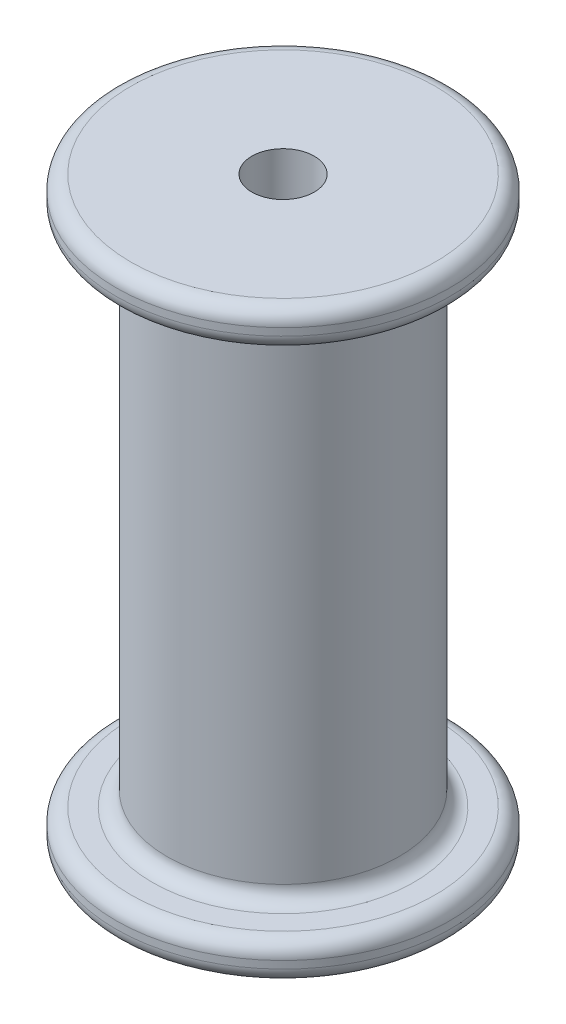
ISO-10303-21;
HEADER;
FILE_DESCRIPTION(('STEP AP214'),'2;1');
FILE_NAME('part.step','',(''),(''),'','','');
FILE_SCHEMA(('AUTOMOTIVE_DESIGN { 1 0 10303 214 1 1 1 1 }'));
ENDSEC;
DATA;
#1=APPLICATION_CONTEXT('core data for automotive mechanical design processes');
#2=APPLICATION_PROTOCOL_DEFINITION('international standard','automotive_design',2000,#1);
#3=PRODUCT_CONTEXT('',#1,'mechanical');
#4=PRODUCT('Part','Part','',(#3));
#5=PRODUCT_RELATED_PRODUCT_CATEGORY('part','',(#4));
#6=PRODUCT_DEFINITION_FORMATION('','',#4);
#7=PRODUCT_DEFINITION_CONTEXT('part definition',#1,'design');
#8=PRODUCT_DEFINITION('design','',#6,#7);
#9=PRODUCT_DEFINITION_SHAPE('','',#8);
#10=(LENGTH_UNIT() NAMED_UNIT(*) SI_UNIT(.MILLI.,.METRE.));
#11=(NAMED_UNIT(*) PLANE_ANGLE_UNIT() SI_UNIT($,.RADIAN.));
#12=(NAMED_UNIT(*) SI_UNIT($,.STERADIAN.) SOLID_ANGLE_UNIT());
#13=UNCERTAINTY_MEASURE_WITH_UNIT(LENGTH_MEASURE(1.E-05),#10,'distance_accuracy_value','');
#14=(GEOMETRIC_REPRESENTATION_CONTEXT(3) GLOBAL_UNCERTAINTY_ASSIGNED_CONTEXT((#13)) GLOBAL_UNIT_ASSIGNED_CONTEXT((#10,
#11,#12)) REPRESENTATION_CONTEXT('',''));
#15=CARTESIAN_POINT('',(0.,0.,0.));
#16=DIRECTION('',(0.,0.,1.));
#17=DIRECTION('',(1.,0.,0.));
#18=AXIS2_PLACEMENT_3D('',#15,#16,#17);
#19=CARTESIAN_POINT('',(0.,50.038,0.));
#20=DIRECTION('',(0.,-1.,0.));
#21=DIRECTION('',(0.,0.,-1.));
#22=AXIS2_PLACEMENT_3D('',#19,#20,#21);
#23=CYLINDRICAL_SURFACE('',#22,9.906);
#24=CARTESIAN_POINT('',(0.,4.445,0.));
#25=DIRECTION('',(0.,1.,0.));
#26=DIRECTION('',(0.,0.,1.));
#27=AXIS2_PLACEMENT_3D('',#24,#25,#26);
#28=CIRCLE('',#27,9.906);
#29=CARTESIAN_POINT('',(0.,4.445,9.906));
#30=VERTEX_POINT('',#29);
#31=EDGE_CURVE('E54',#30,#30,#28,.T.);
#32=ORIENTED_EDGE('',*,*,#31,.T.);
#33=EDGE_LOOP('',(#32));
#34=FACE_BOUND('',#33,.T.);
#35=CARTESIAN_POINT('',(0.,45.593,0.));
#36=DIRECTION('',(0.,1.,0.));
#37=DIRECTION('',(0.,0.,1.));
#38=AXIS2_PLACEMENT_3D('',#35,#36,#37);
#39=CIRCLE('',#38,9.906);
#40=CARTESIAN_POINT('',(0.,45.593,9.906));
#41=VERTEX_POINT('',#40);
#42=EDGE_CURVE('E57',#41,#41,#39,.F.);
#43=ORIENTED_EDGE('',*,*,#42,.T.);
#44=EDGE_LOOP('',(#43));
#45=FACE_BOUND('',#44,.T.);
#46=ADVANCED_FACE('F31',(#34,#45),#23,.T.);
#47=CARTESIAN_POINT('',(0.,50.038,0.));
#48=DIRECTION('',(0.,1.,0.));
#49=DIRECTION('',(0.,0.,1.));
#50=AXIS2_PLACEMENT_3D('',#47,#48,#49);
#51=PLANE('',#50);
#52=CARTESIAN_POINT('',(0.,50.038,0.));
#53=DIRECTION('',(0.,1.,0.));
#54=DIRECTION('',(0.,0.,1.));
#55=AXIS2_PLACEMENT_3D('',#52,#53,#54);
#56=CIRCLE('',#55,13.0175);
#57=CARTESIAN_POINT('',(0.,50.038,13.0175));
#58=VERTEX_POINT('',#57);
#59=EDGE_CURVE('E51',#58,#58,#56,.T.);
#60=ORIENTED_EDGE('',*,*,#59,.T.);
#61=EDGE_LOOP('',(#60));
#62=FACE_BOUND('',#61,.T.);
#63=CARTESIAN_POINT('',(0.,50.038,0.));
#64=DIRECTION('',(0.,1.,0.));
#65=DIRECTION('',(0.,0.,1.));
#66=AXIS2_PLACEMENT_3D('',#63,#64,#65);
#67=CIRCLE('',#66,2.667);
#68=CARTESIAN_POINT('',(0.,50.038,2.667));
#69=VERTEX_POINT('',#68);
#70=EDGE_CURVE('E75',#69,#69,#67,.T.);
#71=ORIENTED_EDGE('',*,*,#70,.F.);
#72=EDGE_LOOP('',(#71));
#73=FACE_BOUND('',#72,.T.);
#74=ADVANCED_FACE('F85',(#62,#73),#51,.T.);
#75=CARTESIAN_POINT('',(0.,0.,0.));
#76=DIRECTION('',(0.,1.,0.));
#77=DIRECTION('',(0.,0.,1.));
#78=AXIS2_PLACEMENT_3D('',#75,#76,#77);
#79=PLANE('',#78);
#80=CARTESIAN_POINT('',(0.,0.,0.));
#81=DIRECTION('',(0.,1.,0.));
#82=DIRECTION('',(0.,0.,1.));
#83=AXIS2_PLACEMENT_3D('',#80,#81,#82);
#84=CIRCLE('',#83,13.0175);
#85=CARTESIAN_POINT('',(0.,0.,13.0175));
#86=VERTEX_POINT('',#85);
#87=EDGE_CURVE('E66',#86,#86,#84,.F.);
#88=ORIENTED_EDGE('',*,*,#87,.T.);
#89=EDGE_LOOP('',(#88));
#90=FACE_BOUND('',#89,.T.);
#91=CARTESIAN_POINT('',(0.,0.,0.));
#92=DIRECTION('',(0.,1.,0.));
#93=DIRECTION('',(0.,0.,1.));
#94=AXIS2_PLACEMENT_3D('',#91,#92,#93);
#95=CIRCLE('',#94,2.667);
#96=CARTESIAN_POINT('',(0.,0.,2.667));
#97=VERTEX_POINT('',#96);
#98=EDGE_CURVE('E76',#97,#97,#95,.T.);
#99=ORIENTED_EDGE('',*,*,#98,.T.);
#100=EDGE_LOOP('',(#99));
#101=FACE_BOUND('',#100,.T.);
#102=ADVANCED_FACE('F87',(#90,#101),#79,.F.);
#103=CARTESIAN_POINT('',(0.,50.038,0.));
#104=DIRECTION('',(0.,-1.,0.));
#105=DIRECTION('',(0.,0.,-1.));
#106=AXIS2_PLACEMENT_3D('',#103,#104,#105);
#107=CYLINDRICAL_SURFACE('',#106,2.667);
#108=ORIENTED_EDGE('',*,*,#70,.T.);
#109=EDGE_LOOP('',(#108));
#110=FACE_BOUND('',#109,.T.);
#111=ORIENTED_EDGE('',*,*,#98,.F.);
#112=EDGE_LOOP('',(#111));
#113=FACE_BOUND('',#112,.T.);
#114=ADVANCED_FACE('F82',(#110,#113),#107,.F.);
#115=CARTESIAN_POINT('',(0.,46.863,0.));
#116=DIRECTION('',(0.,1.,0.));
#117=DIRECTION('',(0.,0.,1.));
#118=AXIS2_PLACEMENT_3D('',#115,#116,#117);
#119=PLANE('',#118);
#120=CARTESIAN_POINT('',(0.,46.863,0.));
#121=DIRECTION('',(0.,1.,0.));
#122=DIRECTION('',(0.,0.,1.));
#123=AXIS2_PLACEMENT_3D('',#120,#121,#122);
#124=CIRCLE('',#123,13.0175);
#125=CARTESIAN_POINT('',(0.,46.863,13.0175));
#126=VERTEX_POINT('',#125);
#127=EDGE_CURVE('E10',#126,#126,#124,.F.);
#128=ORIENTED_EDGE('',*,*,#127,.T.);
#129=EDGE_LOOP('',(#128));
#130=FACE_BOUND('',#129,.T.);
#131=CARTESIAN_POINT('',(0.,46.863,0.));
#132=DIRECTION('',(0.,1.,0.));
#133=DIRECTION('',(0.,0.,1.));
#134=AXIS2_PLACEMENT_3D('',#131,#132,#133);
#135=CIRCLE('',#134,11.176);
#136=CARTESIAN_POINT('',(0.,46.863,11.176));
#137=VERTEX_POINT('',#136);
#138=EDGE_CURVE('E38',#137,#137,#135,.T.);
#139=ORIENTED_EDGE('',*,*,#138,.T.);
#140=EDGE_LOOP('',(#139));
#141=FACE_BOUND('',#140,.T.);
#142=ADVANCED_FACE('F130',(#130,#141),#119,.F.);
#143=CARTESIAN_POINT('',(0.,46.863,0.));
#144=DIRECTION('',(0.,1.,0.));
#145=DIRECTION('',(0.,0.,1.));
#146=AXIS2_PLACEMENT_3D('',#143,#144,#145);
#147=CYLINDRICAL_SURFACE('',#146,14.2875);
#148=CARTESIAN_POINT('',(0.,48.768,0.));
#149=DIRECTION('',(0.,1.,0.));
#150=DIRECTION('',(0.,0.,1.));
#151=AXIS2_PLACEMENT_3D('',#148,#149,#150);
#152=CIRCLE('',#151,14.2875);
#153=CARTESIAN_POINT('',(0.,48.768,14.2875));
#154=VERTEX_POINT('',#153);
#155=EDGE_CURVE('E42',#154,#154,#152,.F.);
#156=ORIENTED_EDGE('',*,*,#155,.T.);
#157=EDGE_LOOP('',(#156));
#158=FACE_BOUND('',#157,.T.);
#159=CARTESIAN_POINT('',(0.,48.133,0.));
#160=DIRECTION('',(0.,1.,0.));
#161=DIRECTION('',(0.,0.,1.));
#162=AXIS2_PLACEMENT_3D('',#159,#160,#161);
#163=CIRCLE('',#162,14.2875);
#164=CARTESIAN_POINT('',(0.,48.133,14.2875));
#165=VERTEX_POINT('',#164);
#166=EDGE_CURVE('E46',#165,#165,#163,.T.);
#167=ORIENTED_EDGE('',*,*,#166,.T.);
#168=EDGE_LOOP('',(#167));
#169=FACE_BOUND('',#168,.T.);
#170=ADVANCED_FACE('F127',(#158,#169),#147,.T.);
#171=CARTESIAN_POINT('',(0.,3.175,0.));
#172=DIRECTION('',(0.,1.,0.));
#173=DIRECTION('',(0.,0.,1.));
#174=AXIS2_PLACEMENT_3D('',#171,#172,#173);
#175=PLANE('',#174);
#176=CARTESIAN_POINT('',(0.,3.175,0.));
#177=DIRECTION('',(0.,1.,0.));
#178=DIRECTION('',(0.,0.,1.));
#179=AXIS2_PLACEMENT_3D('',#176,#177,#178);
#180=CIRCLE('',#179,13.0175);
#181=CARTESIAN_POINT('',(0.,3.175,13.0175));
#182=VERTEX_POINT('',#181);
#183=EDGE_CURVE('E60',#182,#182,#180,.T.);
#184=ORIENTED_EDGE('',*,*,#183,.T.);
#185=EDGE_LOOP('',(#184));
#186=FACE_BOUND('',#185,.T.);
#187=CARTESIAN_POINT('',(0.,3.175,0.));
#188=DIRECTION('',(0.,1.,0.));
#189=DIRECTION('',(0.,0.,1.));
#190=AXIS2_PLACEMENT_3D('',#187,#188,#189);
#191=CIRCLE('',#190,11.176);
#192=CARTESIAN_POINT('',(0.,3.175,11.176));
#193=VERTEX_POINT('',#192);
#194=EDGE_CURVE('E63',#193,#193,#191,.F.);
#195=ORIENTED_EDGE('',*,*,#194,.T.);
#196=EDGE_LOOP('',(#195));
#197=FACE_BOUND('',#196,.T.);
#198=ADVANCED_FACE('F129',(#186,#197),#175,.T.);
#199=CARTESIAN_POINT('',(0.,3.175,0.));
#200=DIRECTION('',(0.,-1.,0.));
#201=DIRECTION('',(0.,0.,-1.));
#202=AXIS2_PLACEMENT_3D('',#199,#200,#201);
#203=CYLINDRICAL_SURFACE('',#202,14.2875);
#204=CARTESIAN_POINT('',(0.,1.27,0.));
#205=DIRECTION('',(0.,1.,0.));
#206=DIRECTION('',(0.,0.,1.));
#207=AXIS2_PLACEMENT_3D('',#204,#205,#206);
#208=CIRCLE('',#207,14.2875);
#209=CARTESIAN_POINT('',(0.,1.27,14.2875));
#210=VERTEX_POINT('',#209);
#211=EDGE_CURVE('E69',#210,#210,#208,.T.);
#212=ORIENTED_EDGE('',*,*,#211,.T.);
#213=EDGE_LOOP('',(#212));
#214=FACE_BOUND('',#213,.T.);
#215=CARTESIAN_POINT('',(0.,1.905,0.));
#216=DIRECTION('',(0.,1.,0.));
#217=DIRECTION('',(0.,0.,1.));
#218=AXIS2_PLACEMENT_3D('',#215,#216,#217);
#219=CIRCLE('',#218,14.2875);
#220=CARTESIAN_POINT('',(0.,1.905,14.2875));
#221=VERTEX_POINT('',#220);
#222=EDGE_CURVE('E72',#221,#221,#219,.F.);
#223=ORIENTED_EDGE('',*,*,#222,.T.);
#224=EDGE_LOOP('',(#223));
#225=FACE_BOUND('',#224,.T.);
#226=ADVANCED_FACE('F105',(#214,#225),#203,.T.);
#227=CARTESIAN_POINT('',(0.,1.27,0.));
#228=DIRECTION('',(0.,1.,0.));
#229=DIRECTION('',(0.,0.,1.));
#230=AXIS2_PLACEMENT_3D('',#227,#228,#229);
#231=TOROIDAL_SURFACE('',#230,13.0175,1.27);
#232=ORIENTED_EDGE('',*,*,#87,.F.);
#233=EDGE_LOOP('',(#232));
#234=FACE_BOUND('',#233,.T.);
#235=ORIENTED_EDGE('',*,*,#211,.F.);
#236=EDGE_LOOP('',(#235));
#237=FACE_BOUND('',#236,.T.);
#238=ADVANCED_FACE('F101',(#234,#237),#231,.T.);
#239=CARTESIAN_POINT('',(0.,1.905,0.));
#240=DIRECTION('',(0.,1.,0.));
#241=DIRECTION('',(0.,0.,1.));
#242=AXIS2_PLACEMENT_3D('',#239,#240,#241);
#243=TOROIDAL_SURFACE('',#242,13.0175,1.27);
#244=ORIENTED_EDGE('',*,*,#222,.F.);
#245=EDGE_LOOP('',(#244));
#246=FACE_BOUND('',#245,.T.);
#247=ORIENTED_EDGE('',*,*,#183,.F.);
#248=EDGE_LOOP('',(#247));
#249=FACE_BOUND('',#248,.T.);
#250=ADVANCED_FACE('F104',(#246,#249),#243,.T.);
#251=CARTESIAN_POINT('',(0.,4.445,0.));
#252=DIRECTION('',(0.,1.,0.));
#253=DIRECTION('',(0.,0.,1.));
#254=AXIS2_PLACEMENT_3D('',#251,#252,#253);
#255=TOROIDAL_SURFACE('',#254,11.176,1.27);
#256=ORIENTED_EDGE('',*,*,#194,.F.);
#257=EDGE_LOOP('',(#256));
#258=FACE_BOUND('',#257,.T.);
#259=ORIENTED_EDGE('',*,*,#31,.F.);
#260=EDGE_LOOP('',(#259));
#261=FACE_BOUND('',#260,.T.);
#262=ADVANCED_FACE('F109',(#258,#261),#255,.F.);
#263=CARTESIAN_POINT('',(0.,48.768,0.));
#264=DIRECTION('',(0.,1.,0.));
#265=DIRECTION('',(0.,0.,1.));
#266=AXIS2_PLACEMENT_3D('',#263,#264,#265);
#267=TOROIDAL_SURFACE('',#266,13.0175,1.27);
#268=ORIENTED_EDGE('',*,*,#155,.F.);
#269=EDGE_LOOP('',(#268));
#270=FACE_BOUND('',#269,.T.);
#271=ORIENTED_EDGE('',*,*,#59,.F.);
#272=EDGE_LOOP('',(#271));
#273=FACE_BOUND('',#272,.T.);
#274=ADVANCED_FACE('F113',(#270,#273),#267,.T.);
#275=CARTESIAN_POINT('',(0.,48.133,0.));
#276=DIRECTION('',(0.,1.,0.));
#277=DIRECTION('',(0.,0.,1.));
#278=AXIS2_PLACEMENT_3D('',#275,#276,#277);
#279=TOROIDAL_SURFACE('',#278,13.0175,1.27);
#280=ORIENTED_EDGE('',*,*,#127,.F.);
#281=EDGE_LOOP('',(#280));
#282=FACE_BOUND('',#281,.T.);
#283=ORIENTED_EDGE('',*,*,#166,.F.);
#284=EDGE_LOOP('',(#283));
#285=FACE_BOUND('',#284,.T.);
#286=ADVANCED_FACE('F116',(#282,#285),#279,.T.);
#287=CARTESIAN_POINT('',(0.,45.593,0.));
#288=DIRECTION('',(0.,1.,0.));
#289=DIRECTION('',(0.,0.,1.));
#290=AXIS2_PLACEMENT_3D('',#287,#288,#289);
#291=TOROIDAL_SURFACE('',#290,11.176,1.27);
#292=ORIENTED_EDGE('',*,*,#42,.F.);
#293=EDGE_LOOP('',(#292));
#294=FACE_BOUND('',#293,.T.);
#295=ORIENTED_EDGE('',*,*,#138,.F.);
#296=EDGE_LOOP('',(#295));
#297=FACE_BOUND('',#296,.T.);
#298=ADVANCED_FACE('F33',(#294,#297),#291,.F.);
#299=CLOSED_SHELL('',(#46,#74,#102,#114,#142,#170,#198,#226,#238,#250,#262,#274,#286,#298));
#300=MANIFOLD_SOLID_BREP('B2',#299);
#301=ADVANCED_BREP_SHAPE_REPRESENTATION('',(#18,#300),#14);
#302=SHAPE_DEFINITION_REPRESENTATION(#9,#301);
ENDSEC;
END-ISO-10303-21;
